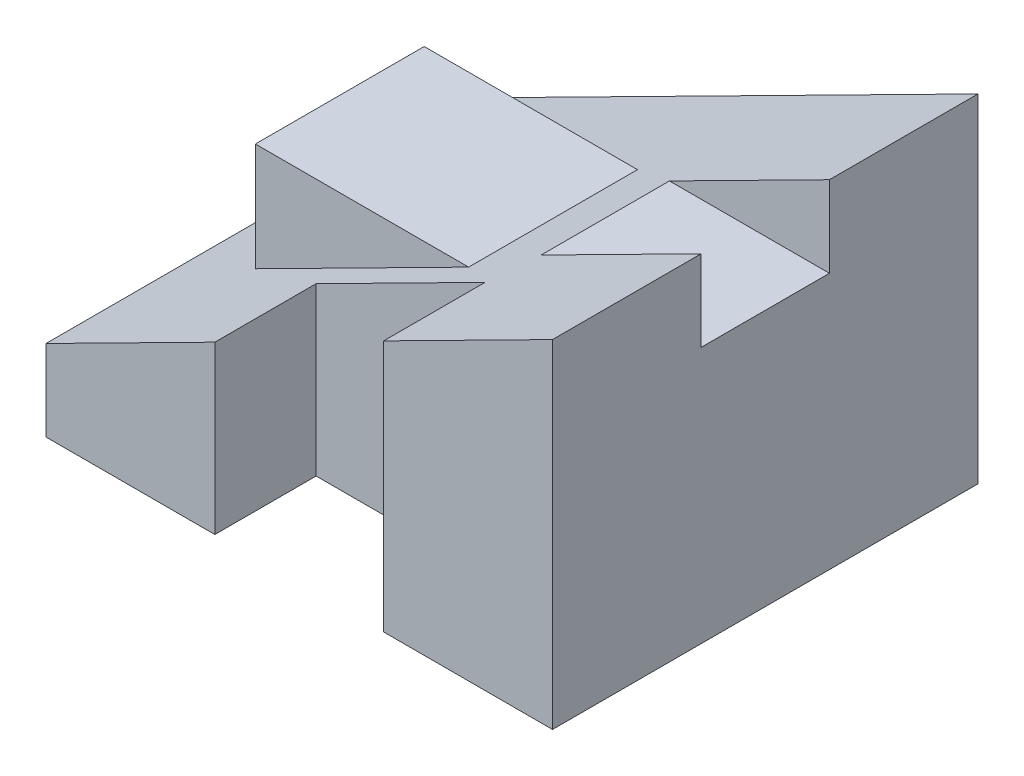
ISO-10303-21;
HEADER;
FILE_DESCRIPTION(('STEP AP214'),'2;1');
FILE_NAME('part.step','',(''),(''),'','','');
FILE_SCHEMA(('AUTOMOTIVE_DESIGN { 1 0 10303 214 1 1 1 1 }'));
ENDSEC;
DATA;
#1=APPLICATION_CONTEXT('core data for automotive mechanical design processes');
#2=APPLICATION_PROTOCOL_DEFINITION('international standard','automotive_design',2000,#1);
#3=PRODUCT_CONTEXT('',#1,'mechanical');
#4=PRODUCT('Part','Part','',(#3));
#5=PRODUCT_RELATED_PRODUCT_CATEGORY('part','',(#4));
#6=PRODUCT_DEFINITION_FORMATION('','',#4);
#7=PRODUCT_DEFINITION_CONTEXT('part definition',#1,'design');
#8=PRODUCT_DEFINITION('design','',#6,#7);
#9=PRODUCT_DEFINITION_SHAPE('','',#8);
#10=(LENGTH_UNIT() NAMED_UNIT(*) SI_UNIT(.MILLI.,.METRE.));
#11=(NAMED_UNIT(*) PLANE_ANGLE_UNIT() SI_UNIT($,.RADIAN.));
#12=(NAMED_UNIT(*) SI_UNIT($,.STERADIAN.) SOLID_ANGLE_UNIT());
#13=UNCERTAINTY_MEASURE_WITH_UNIT(LENGTH_MEASURE(1.E-05),#10,'distance_accuracy_value','');
#14=(GEOMETRIC_REPRESENTATION_CONTEXT(3) GLOBAL_UNCERTAINTY_ASSIGNED_CONTEXT((#13)) GLOBAL_UNIT_ASSIGNED_CONTEXT((#10,
#11,#12)) REPRESENTATION_CONTEXT('',''));
#15=CARTESIAN_POINT('',(0.,0.,0.));
#16=DIRECTION('',(0.,0.,1.));
#17=DIRECTION('',(1.,0.,0.));
#18=AXIS2_PLACEMENT_3D('',#15,#16,#17);
#19=CARTESIAN_POINT('',(-4.83802518036497,9.54873390861508,-63.));
#20=DIRECTION('',(-0.451964793188669,0.892035776030268,0.));
#21=DIRECTION('',(-0.892035776030269,-0.45196479318867,0.));
#22=AXIS2_PLACEMENT_3D('',#19,#20,#21);
#23=PLANE('',#22);
#24=DIRECTION('',(0.,0.,1.));
#25=VECTOR('',#24,1.);
#26=CARTESIAN_POINT('',(43.578947368421,34.08,-44.));
#27=LINE('',#26,#25);
#28=CARTESIAN_POINT('',(43.578947368421,34.08,-44.));
#29=VERTEX_POINT('',#28);
#30=CARTESIAN_POINT('',(43.578947368421,34.08,-19.));
#31=VERTEX_POINT('',#30);
#32=EDGE_CURVE('E194',#29,#31,#27,.T.);
#33=ORIENTED_EDGE('',*,*,#32,.T.);
#34=DIRECTION('',(-0.892035776030269,-0.45196479318867,0.));
#35=VECTOR('',#34,1.);
#36=CARTESIAN_POINT('',(-4.83802518036497,9.54873390861508,-19.));
#37=LINE('',#36,#35);
#38=CARTESIAN_POINT('',(12.,18.08,-19.));
#39=VERTEX_POINT('',#38);
#40=EDGE_CURVE('E179',#31,#39,#37,.T.);
#41=ORIENTED_EDGE('',*,*,#40,.T.);
#42=DIRECTION('',(0.,0.,1.));
#43=VECTOR('',#42,1.);
#44=CARTESIAN_POINT('',(12.,18.08,-44.));
#45=LINE('',#44,#43);
#46=CARTESIAN_POINT('',(12.,18.08,-44.));
#47=VERTEX_POINT('',#46);
#48=EDGE_CURVE('E199',#47,#39,#45,.T.);
#49=ORIENTED_EDGE('',*,*,#48,.F.);
#50=DIRECTION('',(-0.892035776030269,-0.45196479318867,0.));
#51=VECTOR('',#50,1.);
#52=CARTESIAN_POINT('',(-4.83802518036497,9.54873390861508,-44.));
#53=LINE('',#52,#51);
#54=EDGE_CURVE('E182',#29,#47,#53,.T.);
#55=ORIENTED_EDGE('',*,*,#54,.F.);
#56=EDGE_LOOP('',(#33,#41,#49,#55));
#57=FACE_BOUND('',#56,.T.);
#58=DIRECTION('',(0.,0.,1.));
#59=VECTOR('',#58,1.);
#60=CARTESIAN_POINT('',(51.3157894736842,38.,-41.));
#61=LINE('',#60,#59);
#62=CARTESIAN_POINT('',(51.3157894736842,38.,-41.));
#63=VERTEX_POINT('',#62);
#64=CARTESIAN_POINT('',(51.3157894736842,38.,-22.));
#65=VERTEX_POINT('',#64);
#66=EDGE_CURVE('E149',#63,#65,#61,.T.);
#67=ORIENTED_EDGE('',*,*,#66,.F.);
#68=DIRECTION('',(-0.892035776030269,-0.45196479318867,0.));
#69=VECTOR('',#68,1.);
#70=CARTESIAN_POINT('',(-4.83802518036497,9.54873390861508,-41.));
#71=LINE('',#70,#69);
#72=CARTESIAN_POINT('',(75.,50.,-41.));
#73=VERTEX_POINT('',#72);
#74=EDGE_CURVE('E156',#73,#63,#71,.T.);
#75=ORIENTED_EDGE('',*,*,#74,.F.);
#76=DIRECTION('',(0.,0.,1.));
#77=VECTOR('',#76,1.);
#78=CARTESIAN_POINT('',(75.,50.,-63.));
#79=LINE('',#78,#77);
#80=CARTESIAN_POINT('',(75.,50.,-63.));
#81=VERTEX_POINT('',#80);
#82=EDGE_CURVE('E275',#81,#73,#79,.T.);
#83=ORIENTED_EDGE('',*,*,#82,.F.);
#84=DIRECTION('',(-0.892035776030269,-0.45196479318867,0.));
#85=VECTOR('',#84,1.);
#86=CARTESIAN_POINT('',(-4.83802518036497,9.54873390861508,-63.));
#87=LINE('',#86,#85);
#88=CARTESIAN_POINT('',(0.,12.,-63.));
#89=VERTEX_POINT('',#88);
#90=EDGE_CURVE('E249',#81,#89,#87,.T.);
#91=ORIENTED_EDGE('',*,*,#90,.T.);
#92=DIRECTION('',(0.,0.,1.));
#93=VECTOR('',#92,1.);
#94=CARTESIAN_POINT('',(0.,12.,-63.));
#95=LINE('',#94,#93);
#96=CARTESIAN_POINT('',(0.,12.,0.));
#97=VERTEX_POINT('',#96);
#98=EDGE_CURVE('E49',#89,#97,#95,.T.);
#99=ORIENTED_EDGE('',*,*,#98,.T.);
#100=DIRECTION('',(-0.892035776030269,-0.45196479318867,0.));
#101=VECTOR('',#100,1.);
#102=CARTESIAN_POINT('',(-4.83802518036497,9.54873390861508,0.));
#103=LINE('',#102,#101);
#104=CARTESIAN_POINT('',(25.,24.6666666666667,0.));
#105=VERTEX_POINT('',#104);
#106=EDGE_CURVE('E265',#105,#97,#103,.T.);
#107=ORIENTED_EDGE('',*,*,#106,.F.);
#108=DIRECTION('',(0.,0.,1.));
#109=VECTOR('',#108,1.);
#110=CARTESIAN_POINT('',(25.,24.6666666666667,-15.));
#111=LINE('',#110,#109);
#112=CARTESIAN_POINT('',(25.,24.6666666666667,-15.));
#113=VERTEX_POINT('',#112);
#114=EDGE_CURVE('E234',#113,#105,#111,.T.);
#115=ORIENTED_EDGE('',*,*,#114,.F.);
#116=DIRECTION('',(-0.892035776030269,-0.45196479318867,0.));
#117=VECTOR('',#116,1.);
#118=CARTESIAN_POINT('',(-4.83802518036497,9.54873390861508,-15.));
#119=LINE('',#118,#117);
#120=CARTESIAN_POINT('',(50.,37.3333333333333,-15.));
#121=VERTEX_POINT('',#120);
#122=EDGE_CURVE('E207',#121,#113,#119,.T.);
#123=ORIENTED_EDGE('',*,*,#122,.F.);
#124=DIRECTION('',(0.,0.,1.));
#125=VECTOR('',#124,1.);
#126=CARTESIAN_POINT('',(50.,37.3333333333333,-15.));
#127=LINE('',#126,#125);
#128=CARTESIAN_POINT('',(50.,37.3333333333333,0.));
#129=VERTEX_POINT('',#128);
#130=EDGE_CURVE('E220',#121,#129,#127,.T.);
#131=ORIENTED_EDGE('',*,*,#130,.T.);
#132=CARTESIAN_POINT('',(75.,50.,0.));
#133=VERTEX_POINT('',#132);
#134=EDGE_CURVE('E266',#133,#129,#103,.T.);
#135=ORIENTED_EDGE('',*,*,#134,.F.);
#136=CARTESIAN_POINT('',(75.,50.,-22.));
#137=VERTEX_POINT('',#136);
#138=EDGE_CURVE('E277',#137,#133,#79,.T.);
#139=ORIENTED_EDGE('',*,*,#138,.F.);
#140=DIRECTION('',(-0.892035776030269,-0.45196479318867,0.));
#141=VECTOR('',#140,1.);
#142=CARTESIAN_POINT('',(-4.83802518036497,9.54873390861508,-22.));
#143=LINE('',#142,#141);
#144=EDGE_CURVE('E57',#137,#65,#143,.T.);
#145=ORIENTED_EDGE('',*,*,#144,.T.);
#146=EDGE_LOOP('',(#67,#75,#83,#91,#99,#107,#115,#123,#131,#135,#139,#145));
#147=FACE_BOUND('',#146,.T.);
#148=ADVANCED_FACE('F39',(#57,#147),#23,.T.);
#149=CARTESIAN_POINT('',(75.,0.,-63.));
#150=DIRECTION('',(1.,0.,0.));
#151=DIRECTION('',(0.,0.,-1.));
#152=AXIS2_PLACEMENT_3D('',#149,#150,#151);
#153=PLANE('',#152);
#154=ORIENTED_EDGE('',*,*,#82,.T.);
#155=DIRECTION('',(0.,1.,0.));
#156=VECTOR('',#155,1.);
#157=CARTESIAN_POINT('',(75.,0.,-41.));
#158=LINE('',#157,#156);
#159=CARTESIAN_POINT('',(75.,38.,-41.));
#160=VERTEX_POINT('',#159);
#161=EDGE_CURVE('E155',#160,#73,#158,.T.);
#162=ORIENTED_EDGE('',*,*,#161,.F.);
#163=DIRECTION('',(0.,0.,1.));
#164=VECTOR('',#163,1.);
#165=CARTESIAN_POINT('',(75.,38.,-41.));
#166=LINE('',#165,#164);
#167=CARTESIAN_POINT('',(75.,38.,-22.));
#168=VERTEX_POINT('',#167);
#169=EDGE_CURVE('E151',#160,#168,#166,.T.);
#170=ORIENTED_EDGE('',*,*,#169,.T.);
#171=DIRECTION('',(0.,1.,0.));
#172=VECTOR('',#171,1.);
#173=CARTESIAN_POINT('',(75.,0.,-22.));
#174=LINE('',#173,#172);
#175=EDGE_CURVE('E163',#168,#137,#174,.T.);
#176=ORIENTED_EDGE('',*,*,#175,.T.);
#177=ORIENTED_EDGE('',*,*,#138,.T.);
#178=DIRECTION('',(0.,1.,0.));
#179=VECTOR('',#178,1.);
#180=CARTESIAN_POINT('',(75.,0.,0.));
#181=LINE('',#180,#179);
#182=CARTESIAN_POINT('',(75.,0.,0.));
#183=VERTEX_POINT('',#182);
#184=EDGE_CURVE('E261',#183,#133,#181,.T.);
#185=ORIENTED_EDGE('',*,*,#184,.F.);
#186=DIRECTION('',(0.,0.,1.));
#187=VECTOR('',#186,1.);
#188=CARTESIAN_POINT('',(75.,0.,-63.));
#189=LINE('',#188,#187);
#190=CARTESIAN_POINT('',(75.,0.,-63.));
#191=VERTEX_POINT('',#190);
#192=EDGE_CURVE('E43',#191,#183,#189,.T.);
#193=ORIENTED_EDGE('',*,*,#192,.F.);
#194=DIRECTION('',(0.,1.,0.));
#195=VECTOR('',#194,1.);
#196=CARTESIAN_POINT('',(75.,0.,-63.));
#197=LINE('',#196,#195);
#198=EDGE_CURVE('E244',#191,#81,#197,.T.);
#199=ORIENTED_EDGE('',*,*,#198,.T.);
#200=EDGE_LOOP('',(#154,#162,#170,#176,#177,#185,#193,#199));
#201=FACE_BOUND('',#200,.T.);
#202=ADVANCED_FACE('F292',(#201),#153,.T.);
#203=CARTESIAN_POINT('',(0.,0.,-63.));
#204=DIRECTION('',(0.,-1.,0.));
#205=DIRECTION('',(0.,0.,-1.));
#206=AXIS2_PLACEMENT_3D('',#203,#204,#205);
#207=PLANE('',#206);
#208=DIRECTION('',(1.,0.,0.));
#209=VECTOR('',#208,1.);
#210=CARTESIAN_POINT('',(0.,0.,0.));
#211=LINE('',#210,#209);
#212=CARTESIAN_POINT('',(50.,0.,0.));
#213=VERTEX_POINT('',#212);
#214=EDGE_CURVE('E229',#213,#183,#211,.T.);
#215=ORIENTED_EDGE('',*,*,#214,.F.);
#216=DIRECTION('',(0.,0.,1.));
#217=VECTOR('',#216,1.);
#218=CARTESIAN_POINT('',(50.,0.,-15.));
#219=LINE('',#218,#217);
#220=CARTESIAN_POINT('',(50.,0.,-15.));
#221=VERTEX_POINT('',#220);
#222=EDGE_CURVE('E226',#221,#213,#219,.T.);
#223=ORIENTED_EDGE('',*,*,#222,.F.);
#224=DIRECTION('',(1.,0.,0.));
#225=VECTOR('',#224,1.);
#226=CARTESIAN_POINT('',(0.,0.,-15.));
#227=LINE('',#226,#225);
#228=CARTESIAN_POINT('',(25.,0.,-15.));
#229=VERTEX_POINT('',#228);
#230=EDGE_CURVE('E216',#229,#221,#227,.T.);
#231=ORIENTED_EDGE('',*,*,#230,.F.);
#232=DIRECTION('',(0.,0.,1.));
#233=VECTOR('',#232,1.);
#234=CARTESIAN_POINT('',(25.,0.,-15.));
#235=LINE('',#234,#233);
#236=CARTESIAN_POINT('',(25.,0.,0.));
#237=VERTEX_POINT('',#236);
#238=EDGE_CURVE('E230',#229,#237,#235,.T.);
#239=ORIENTED_EDGE('',*,*,#238,.T.);
#240=CARTESIAN_POINT('',(0.,0.,0.));
#241=VERTEX_POINT('',#240);
#242=EDGE_CURVE('E257',#241,#237,#211,.T.);
#243=ORIENTED_EDGE('',*,*,#242,.F.);
#244=DIRECTION('',(0.,0.,1.));
#245=VECTOR('',#244,1.);
#246=CARTESIAN_POINT('',(0.,0.,-63.));
#247=LINE('',#246,#245);
#248=CARTESIAN_POINT('',(0.,0.,-63.));
#249=VERTEX_POINT('',#248);
#250=EDGE_CURVE('E11',#249,#241,#247,.T.);
#251=ORIENTED_EDGE('',*,*,#250,.F.);
#252=DIRECTION('',(1.,0.,0.));
#253=VECTOR('',#252,1.);
#254=CARTESIAN_POINT('',(0.,0.,-63.));
#255=LINE('',#254,#253);
#256=EDGE_CURVE('E240',#249,#191,#255,.T.);
#257=ORIENTED_EDGE('',*,*,#256,.T.);
#258=ORIENTED_EDGE('',*,*,#192,.T.);
#259=EDGE_LOOP('',(#215,#223,#231,#239,#243,#251,#257,#258));
#260=FACE_BOUND('',#259,.T.);
#261=ADVANCED_FACE('F41',(#260),#207,.T.);
#262=CARTESIAN_POINT('',(0.,0.,0.));
#263=DIRECTION('',(0.,0.,1.));
#264=DIRECTION('',(1.,0.,0.));
#265=AXIS2_PLACEMENT_3D('',#262,#263,#264);
#266=PLANE('',#265);
#267=ORIENTED_EDGE('',*,*,#134,.T.);
#268=DIRECTION('',(0.,-1.,0.));
#269=VECTOR('',#268,1.);
#270=CARTESIAN_POINT('',(50.,0.,0.));
#271=LINE('',#270,#269);
#272=EDGE_CURVE('E198',#129,#213,#271,.T.);
#273=ORIENTED_EDGE('',*,*,#272,.T.);
#274=ORIENTED_EDGE('',*,*,#214,.T.);
#275=ORIENTED_EDGE('',*,*,#184,.T.);
#276=EDGE_LOOP('',(#267,#273,#274,#275));
#277=FACE_BOUND('',#276,.T.);
#278=ADVANCED_FACE('F294',(#277),#266,.T.);
#279=CARTESIAN_POINT('',(0.,0.,-63.));
#280=DIRECTION('',(-1.,0.,0.));
#281=DIRECTION('',(0.,-1.,0.));
#282=AXIS2_PLACEMENT_3D('',#279,#280,#281);
#283=PLANE('',#282);
#284=DIRECTION('',(0.,-1.,0.));
#285=VECTOR('',#284,1.);
#286=CARTESIAN_POINT('',(0.,0.,0.));
#287=LINE('',#286,#285);
#288=EDGE_CURVE('E245',#97,#241,#287,.T.);
#289=ORIENTED_EDGE('',*,*,#288,.F.);
#290=ORIENTED_EDGE('',*,*,#98,.F.);
#291=DIRECTION('',(0.,-1.,0.));
#292=VECTOR('',#291,1.);
#293=CARTESIAN_POINT('',(0.,0.,-63.));
#294=LINE('',#293,#292);
#295=EDGE_CURVE('E253',#89,#249,#294,.T.);
#296=ORIENTED_EDGE('',*,*,#295,.T.);
#297=ORIENTED_EDGE('',*,*,#250,.T.);
#298=EDGE_LOOP('',(#289,#290,#296,#297));
#299=FACE_BOUND('',#298,.T.);
#300=ADVANCED_FACE('F336',(#299),#283,.T.);
#301=CARTESIAN_POINT('',(0.,0.,-63.));
#302=DIRECTION('',(0.,0.,1.));
#303=DIRECTION('',(1.,0.,0.));
#304=AXIS2_PLACEMENT_3D('',#301,#302,#303);
#305=PLANE('',#304);
#306=ORIENTED_EDGE('',*,*,#256,.F.);
#307=ORIENTED_EDGE('',*,*,#295,.F.);
#308=ORIENTED_EDGE('',*,*,#90,.F.);
#309=ORIENTED_EDGE('',*,*,#198,.F.);
#310=EDGE_LOOP('',(#306,#307,#308,#309));
#311=FACE_BOUND('',#310,.T.);
#312=ADVANCED_FACE('F354',(#311),#305,.F.);
#313=DIRECTION('',(0.,-1.,0.));
#314=VECTOR('',#313,1.);
#315=CARTESIAN_POINT('',(25.,0.,0.));
#316=LINE('',#315,#314);
#317=EDGE_CURVE('E208',#105,#237,#316,.T.);
#318=ORIENTED_EDGE('',*,*,#317,.F.);
#319=ORIENTED_EDGE('',*,*,#106,.T.);
#320=ORIENTED_EDGE('',*,*,#288,.T.);
#321=ORIENTED_EDGE('',*,*,#242,.T.);
#322=EDGE_LOOP('',(#318,#319,#320,#321));
#323=FACE_BOUND('',#322,.T.);
#324=ADVANCED_FACE('F330',(#323),#266,.T.);
#325=CARTESIAN_POINT('',(50.,0.,-15.));
#326=DIRECTION('',(-1.,0.,0.));
#327=DIRECTION('',(0.,-1.,0.));
#328=AXIS2_PLACEMENT_3D('',#325,#326,#327);
#329=PLANE('',#328);
#330=ORIENTED_EDGE('',*,*,#272,.F.);
#331=ORIENTED_EDGE('',*,*,#130,.F.);
#332=DIRECTION('',(0.,-1.,0.));
#333=VECTOR('',#332,1.);
#334=CARTESIAN_POINT('',(50.,0.,-15.));
#335=LINE('',#334,#333);
#336=EDGE_CURVE('E204',#121,#221,#335,.T.);
#337=ORIENTED_EDGE('',*,*,#336,.T.);
#338=ORIENTED_EDGE('',*,*,#222,.T.);
#339=EDGE_LOOP('',(#330,#331,#337,#338));
#340=FACE_BOUND('',#339,.T.);
#341=ADVANCED_FACE('F346',(#340),#329,.T.);
#342=CARTESIAN_POINT('',(25.,0.,-15.));
#343=DIRECTION('',(-1.,0.,0.));
#344=DIRECTION('',(0.,-1.,0.));
#345=AXIS2_PLACEMENT_3D('',#342,#343,#344);
#346=PLANE('',#345);
#347=ORIENTED_EDGE('',*,*,#317,.T.);
#348=ORIENTED_EDGE('',*,*,#238,.F.);
#349=DIRECTION('',(0.,-1.,0.));
#350=VECTOR('',#349,1.);
#351=CARTESIAN_POINT('',(25.,0.,-15.));
#352=LINE('',#351,#350);
#353=EDGE_CURVE('E212',#113,#229,#352,.T.);
#354=ORIENTED_EDGE('',*,*,#353,.F.);
#355=ORIENTED_EDGE('',*,*,#114,.T.);
#356=EDGE_LOOP('',(#347,#348,#354,#355));
#357=FACE_BOUND('',#356,.T.);
#358=ADVANCED_FACE('F340',(#357),#346,.F.);
#359=CARTESIAN_POINT('',(0.,0.,-15.));
#360=DIRECTION('',(0.,0.,1.));
#361=DIRECTION('',(1.,0.,0.));
#362=AXIS2_PLACEMENT_3D('',#359,#360,#361);
#363=PLANE('',#362);
#364=ORIENTED_EDGE('',*,*,#336,.F.);
#365=ORIENTED_EDGE('',*,*,#122,.T.);
#366=ORIENTED_EDGE('',*,*,#353,.T.);
#367=ORIENTED_EDGE('',*,*,#230,.T.);
#368=EDGE_LOOP('',(#364,#365,#366,#367));
#369=FACE_BOUND('',#368,.T.);
#370=ADVANCED_FACE('F343',(#369),#363,.T.);
#371=CARTESIAN_POINT('',(0.,34.08,-44.));
#372=DIRECTION('',(0.,-1.,0.));
#373=DIRECTION('',(0.,0.,-1.));
#374=AXIS2_PLACEMENT_3D('',#371,#372,#373);
#375=PLANE('',#374);
#376=DIRECTION('',(1.,0.,0.));
#377=VECTOR('',#376,1.);
#378=CARTESIAN_POINT('',(0.,34.08,-19.));
#379=LINE('',#378,#377);
#380=CARTESIAN_POINT('',(12.,34.08,-19.));
#381=VERTEX_POINT('',#380);
#382=EDGE_CURVE('E65',#381,#31,#379,.T.);
#383=ORIENTED_EDGE('',*,*,#382,.T.);
#384=ORIENTED_EDGE('',*,*,#32,.F.);
#385=DIRECTION('',(1.,0.,0.));
#386=VECTOR('',#385,1.);
#387=CARTESIAN_POINT('',(0.,34.08,-44.));
#388=LINE('',#387,#386);
#389=CARTESIAN_POINT('',(12.,34.08,-44.));
#390=VERTEX_POINT('',#389);
#391=EDGE_CURVE('E175',#390,#29,#388,.T.);
#392=ORIENTED_EDGE('',*,*,#391,.F.);
#393=DIRECTION('',(0.,0.,1.));
#394=VECTOR('',#393,1.);
#395=CARTESIAN_POINT('',(12.,34.08,-44.));
#396=LINE('',#395,#394);
#397=EDGE_CURVE('E185',#390,#381,#396,.T.);
#398=ORIENTED_EDGE('',*,*,#397,.T.);
#399=EDGE_LOOP('',(#383,#384,#392,#398));
#400=FACE_BOUND('',#399,.T.);
#401=ADVANCED_FACE('F404',(#400),#375,.F.);
#402=CARTESIAN_POINT('',(12.,0.,-44.));
#403=DIRECTION('',(1.,0.,0.));
#404=DIRECTION('',(0.,0.,-1.));
#405=AXIS2_PLACEMENT_3D('',#402,#403,#404);
#406=PLANE('',#405);
#407=DIRECTION('',(0.,1.,0.));
#408=VECTOR('',#407,1.);
#409=CARTESIAN_POINT('',(12.,0.,-19.));
#410=LINE('',#409,#408);
#411=EDGE_CURVE('E188',#39,#381,#410,.T.);
#412=ORIENTED_EDGE('',*,*,#411,.T.);
#413=ORIENTED_EDGE('',*,*,#397,.F.);
#414=DIRECTION('',(0.,1.,0.));
#415=VECTOR('',#414,1.);
#416=CARTESIAN_POINT('',(12.,0.,-44.));
#417=LINE('',#416,#415);
#418=EDGE_CURVE('E178',#47,#390,#417,.T.);
#419=ORIENTED_EDGE('',*,*,#418,.F.);
#420=ORIENTED_EDGE('',*,*,#48,.T.);
#421=EDGE_LOOP('',(#412,#413,#419,#420));
#422=FACE_BOUND('',#421,.T.);
#423=ADVANCED_FACE('F414',(#422),#406,.F.);
#424=CARTESIAN_POINT('',(0.,0.,-44.));
#425=DIRECTION('',(0.,0.,1.));
#426=DIRECTION('',(1.,0.,0.));
#427=AXIS2_PLACEMENT_3D('',#424,#425,#426);
#428=PLANE('',#427);
#429=ORIENTED_EDGE('',*,*,#391,.T.);
#430=ORIENTED_EDGE('',*,*,#54,.T.);
#431=ORIENTED_EDGE('',*,*,#418,.T.);
#432=EDGE_LOOP('',(#429,#430,#431));
#433=FACE_BOUND('',#432,.T.);
#434=ADVANCED_FACE('F424',(#433),#428,.F.);
#435=CARTESIAN_POINT('',(0.,0.,-19.));
#436=DIRECTION('',(0.,0.,1.));
#437=DIRECTION('',(1.,0.,0.));
#438=AXIS2_PLACEMENT_3D('',#435,#436,#437);
#439=PLANE('',#438);
#440=ORIENTED_EDGE('',*,*,#382,.F.);
#441=ORIENTED_EDGE('',*,*,#411,.F.);
#442=ORIENTED_EDGE('',*,*,#40,.F.);
#443=EDGE_LOOP('',(#440,#441,#442));
#444=FACE_BOUND('',#443,.T.);
#445=ADVANCED_FACE('F435',(#444),#439,.T.);
#446=CARTESIAN_POINT('',(0.,38.,-41.));
#447=DIRECTION('',(0.,-1.,0.));
#448=DIRECTION('',(0.,0.,-1.));
#449=AXIS2_PLACEMENT_3D('',#446,#447,#448);
#450=PLANE('',#449);
#451=DIRECTION('',(1.,0.,0.));
#452=VECTOR('',#451,1.);
#453=CARTESIAN_POINT('',(0.,38.,-22.));
#454=LINE('',#453,#452);
#455=EDGE_CURVE('E559',#65,#168,#454,.T.);
#456=ORIENTED_EDGE('',*,*,#455,.T.);
#457=ORIENTED_EDGE('',*,*,#169,.F.);
#458=DIRECTION('',(1.,0.,0.));
#459=VECTOR('',#458,1.);
#460=CARTESIAN_POINT('',(0.,38.,-41.));
#461=LINE('',#460,#459);
#462=EDGE_CURVE('E145',#63,#160,#461,.T.);
#463=ORIENTED_EDGE('',*,*,#462,.F.);
#464=ORIENTED_EDGE('',*,*,#66,.T.);
#465=EDGE_LOOP('',(#456,#457,#463,#464));
#466=FACE_BOUND('',#465,.T.);
#467=ADVANCED_FACE('F147',(#466),#450,.F.);
#468=CARTESIAN_POINT('',(0.,0.,-41.));
#469=DIRECTION('',(0.,0.,1.));
#470=DIRECTION('',(1.,0.,0.));
#471=AXIS2_PLACEMENT_3D('',#468,#469,#470);
#472=PLANE('',#471);
#473=ORIENTED_EDGE('',*,*,#74,.T.);
#474=ORIENTED_EDGE('',*,*,#462,.T.);
#475=ORIENTED_EDGE('',*,*,#161,.T.);
#476=EDGE_LOOP('',(#473,#474,#475));
#477=FACE_BOUND('',#476,.T.);
#478=ADVANCED_FACE('F159',(#477),#472,.T.);
#479=CARTESIAN_POINT('',(0.,0.,-22.));
#480=DIRECTION('',(0.,0.,1.));
#481=DIRECTION('',(1.,0.,0.));
#482=AXIS2_PLACEMENT_3D('',#479,#480,#481);
#483=PLANE('',#482);
#484=ORIENTED_EDGE('',*,*,#144,.F.);
#485=ORIENTED_EDGE('',*,*,#175,.F.);
#486=ORIENTED_EDGE('',*,*,#455,.F.);
#487=EDGE_LOOP('',(#484,#485,#486));
#488=FACE_BOUND('',#487,.T.);
#489=ADVANCED_FACE('F476',(#488),#483,.F.);
#490=CLOSED_SHELL('',(#148,#202,#261,#278,#300,#312,#324,#341,#358,#370,#401,#423,#434,#445,
#467,#478,#489));
#491=MANIFOLD_SOLID_BREP('B2',#490);
#492=ADVANCED_BREP_SHAPE_REPRESENTATION('',(#18,#491),#14);
#493=SHAPE_DEFINITION_REPRESENTATION(#9,#492);
ENDSEC;
END-ISO-10303-21;
